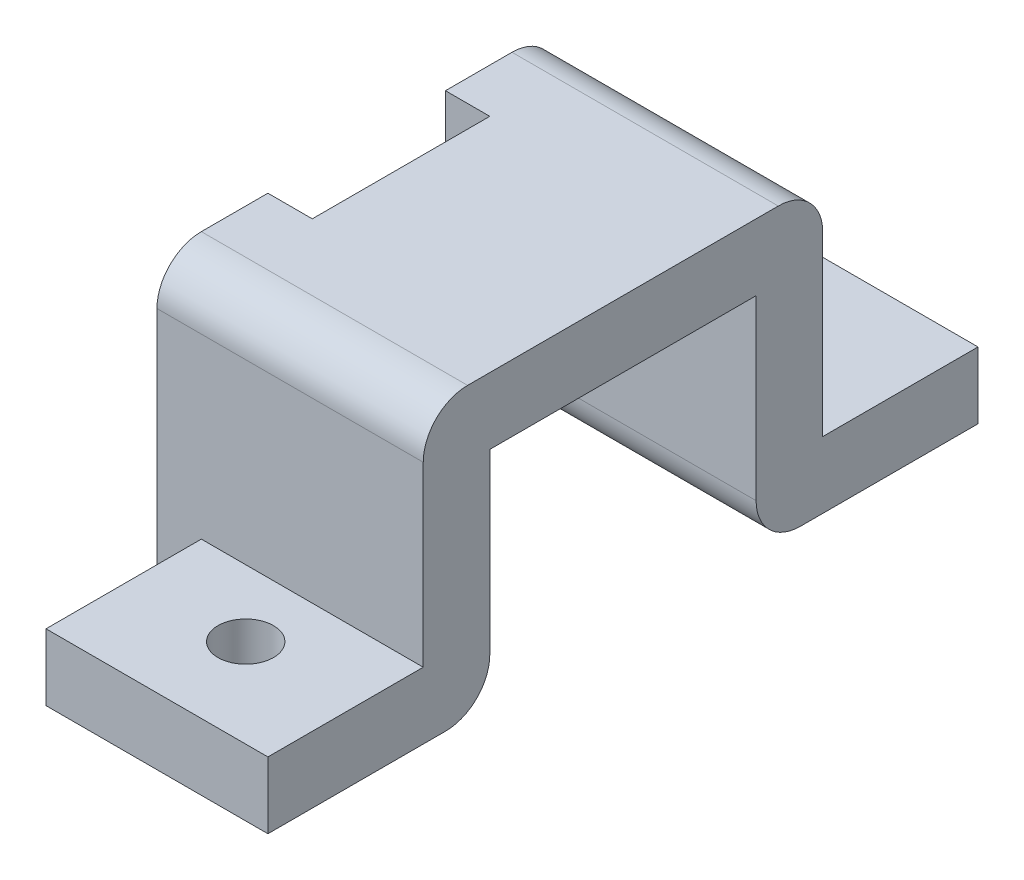
ISO-10303-21;
HEADER;
FILE_DESCRIPTION(('STEP AP214'),'2;1');
FILE_NAME('part.step','',(''),(''),'','','');
FILE_SCHEMA(('AUTOMOTIVE_DESIGN { 1 0 10303 214 1 1 1 1 }'));
ENDSEC;
DATA;
#1=APPLICATION_CONTEXT('core data for automotive mechanical design processes');
#2=APPLICATION_PROTOCOL_DEFINITION('international standard','automotive_design',2000,#1);
#3=PRODUCT_CONTEXT('',#1,'mechanical');
#4=PRODUCT('Part','Part','',(#3));
#5=PRODUCT_RELATED_PRODUCT_CATEGORY('part','',(#4));
#6=PRODUCT_DEFINITION_FORMATION('','',#4);
#7=PRODUCT_DEFINITION_CONTEXT('part definition',#1,'design');
#8=PRODUCT_DEFINITION('design','',#6,#7);
#9=PRODUCT_DEFINITION_SHAPE('','',#8);
#10=(LENGTH_UNIT() NAMED_UNIT(*) SI_UNIT(.MILLI.,.METRE.));
#11=(NAMED_UNIT(*) PLANE_ANGLE_UNIT() SI_UNIT($,.RADIAN.));
#12=(NAMED_UNIT(*) SI_UNIT($,.STERADIAN.) SOLID_ANGLE_UNIT());
#13=UNCERTAINTY_MEASURE_WITH_UNIT(LENGTH_MEASURE(1.E-05),#10,'distance_accuracy_value','');
#14=(GEOMETRIC_REPRESENTATION_CONTEXT(3) GLOBAL_UNCERTAINTY_ASSIGNED_CONTEXT((#13)) GLOBAL_UNIT_ASSIGNED_CONTEXT((#10,
#11,#12)) REPRESENTATION_CONTEXT('',''));
#15=CARTESIAN_POINT('',(0.,0.,0.));
#16=DIRECTION('',(0.,0.,1.));
#17=DIRECTION('',(1.,0.,0.));
#18=AXIS2_PLACEMENT_3D('',#15,#16,#17);
#19=CARTESIAN_POINT('',(10.,-2.,7.));
#20=DIRECTION('',(1.,0.,0.));
#21=DIRECTION('',(0.,0.,-1.));
#22=AXIS2_PLACEMENT_3D('',#19,#20,#21);
#23=CYLINDRICAL_SURFACE('',#22,2.);
#24=DIRECTION('',(-1.,0.,0.));
#25=VECTOR('',#24,1.);
#26=CARTESIAN_POINT('',(10.,-2.,9.));
#27=LINE('',#26,#25);
#28=CARTESIAN_POINT('',(10.,-2.,9.));
#29=VERTEX_POINT('',#28);
#30=CARTESIAN_POINT('',(-2.,-2.,9.));
#31=VERTEX_POINT('',#30);
#32=EDGE_CURVE('E420',#29,#31,#27,.T.);
#33=ORIENTED_EDGE('',*,*,#32,.F.);
#34=CARTESIAN_POINT('',(10.,-2.,7.));
#35=DIRECTION('',(-1.,0.,0.));
#36=DIRECTION('',(0.,0.,1.));
#37=AXIS2_PLACEMENT_3D('',#34,#35,#36);
#38=CIRCLE('',#37,2.);
#39=CARTESIAN_POINT('',(10.,0.,7.));
#40=VERTEX_POINT('',#39);
#41=EDGE_CURVE('E42',#40,#29,#38,.F.);
#42=ORIENTED_EDGE('',*,*,#41,.F.);
#43=DIRECTION('',(-1.,0.,0.));
#44=VECTOR('',#43,1.);
#45=CARTESIAN_POINT('',(10.,0.,7.));
#46=LINE('',#45,#44);
#47=CARTESIAN_POINT('',(-2.,0.,7.));
#48=VERTEX_POINT('',#47);
#49=EDGE_CURVE('E423',#48,#40,#46,.F.);
#50=ORIENTED_EDGE('',*,*,#49,.F.);
#51=CARTESIAN_POINT('',(-2.,-2.,7.));
#52=DIRECTION('',(1.,0.,0.));
#53=DIRECTION('',(0.,0.,-1.));
#54=AXIS2_PLACEMENT_3D('',#51,#52,#53);
#55=CIRCLE('',#54,2.);
#56=EDGE_CURVE('E11',#31,#48,#55,.F.);
#57=ORIENTED_EDGE('',*,*,#56,.F.);
#58=EDGE_LOOP('',(#33,#42,#50,#57));
#59=FACE_BOUND('',#58,.T.);
#60=ADVANCED_FACE('F35',(#59),#23,.T.);
#61=CARTESIAN_POINT('',(10.,-2.,-7.));
#62=DIRECTION('',(1.,0.,0.));
#63=DIRECTION('',(0.,0.,-1.));
#64=AXIS2_PLACEMENT_3D('',#61,#62,#63);
#65=CYLINDRICAL_SURFACE('',#64,2.);
#66=DIRECTION('',(1.,0.,0.));
#67=VECTOR('',#66,1.);
#68=CARTESIAN_POINT('',(10.,-2.,-9.));
#69=LINE('',#68,#67);
#70=CARTESIAN_POINT('',(-2.,-1.99999999999999,-9.));
#71=VERTEX_POINT('',#70);
#72=CARTESIAN_POINT('',(10.,-2.,-9.));
#73=VERTEX_POINT('',#72);
#74=EDGE_CURVE('E409',#71,#73,#69,.T.);
#75=ORIENTED_EDGE('',*,*,#74,.F.);
#76=CARTESIAN_POINT('',(-2.,-2.,-7.));
#77=DIRECTION('',(-1.,0.,0.));
#78=DIRECTION('',(0.,0.,1.));
#79=AXIS2_PLACEMENT_3D('',#76,#77,#78);
#80=CIRCLE('',#79,2.);
#81=CARTESIAN_POINT('',(-2.,0.,-7.));
#82=VERTEX_POINT('',#81);
#83=EDGE_CURVE('E415',#82,#71,#80,.T.);
#84=ORIENTED_EDGE('',*,*,#83,.F.);
#85=DIRECTION('',(1.,0.,0.));
#86=VECTOR('',#85,1.);
#87=CARTESIAN_POINT('',(10.,0.,-7.));
#88=LINE('',#87,#86);
#89=CARTESIAN_POINT('',(10.,0.,-7.));
#90=VERTEX_POINT('',#89);
#91=EDGE_CURVE('E412',#90,#82,#88,.F.);
#92=ORIENTED_EDGE('',*,*,#91,.F.);
#93=CARTESIAN_POINT('',(10.,-2.,-7.));
#94=DIRECTION('',(-1.,0.,0.));
#95=DIRECTION('',(0.,0.,1.));
#96=AXIS2_PLACEMENT_3D('',#93,#94,#95);
#97=CIRCLE('',#96,2.);
#98=EDGE_CURVE('E417',#73,#90,#97,.F.);
#99=ORIENTED_EDGE('',*,*,#98,.F.);
#100=EDGE_LOOP('',(#75,#84,#92,#99));
#101=FACE_BOUND('',#100,.T.);
#102=ADVANCED_FACE('F527',(#101),#65,.T.);
#103=CARTESIAN_POINT('',(10.,-3.,-6.));
#104=DIRECTION('',(0.,-1.,0.));
#105=DIRECTION('',(0.,0.,-1.));
#106=AXIS2_PLACEMENT_3D('',#103,#104,#105);
#107=PLANE('',#106);
#108=DIRECTION('',(-1.,0.,0.));
#109=VECTOR('',#108,1.);
#110=CARTESIAN_POINT('',(8.,-3.,-1.));
#111=LINE('',#110,#109);
#112=CARTESIAN_POINT('',(8.,-3.,-1.));
#113=VERTEX_POINT('',#112);
#114=CARTESIAN_POINT('',(6.5,-3.,-1.));
#115=VERTEX_POINT('',#114);
#116=EDGE_CURVE('E472',#113,#115,#111,.T.);
#117=ORIENTED_EDGE('',*,*,#116,.F.);
#118=DIRECTION('',(0.,0.,1.));
#119=VECTOR('',#118,1.);
#120=CARTESIAN_POINT('',(8.,-3.,-6.));
#121=LINE('',#120,#119);
#122=CARTESIAN_POINT('',(8.,-3.,-6.));
#123=VERTEX_POINT('',#122);
#124=EDGE_CURVE('E234',#123,#113,#121,.T.);
#125=ORIENTED_EDGE('',*,*,#124,.F.);
#126=DIRECTION('',(-1.,0.,0.));
#127=VECTOR('',#126,1.);
#128=CARTESIAN_POINT('',(10.,-3.,-6.));
#129=LINE('',#128,#127);
#130=CARTESIAN_POINT('',(10.,-3.,-6.));
#131=VERTEX_POINT('',#130);
#132=EDGE_CURVE('E370',#131,#123,#129,.T.);
#133=ORIENTED_EDGE('',*,*,#132,.F.);
#134=DIRECTION('',(0.,0.,1.));
#135=VECTOR('',#134,1.);
#136=CARTESIAN_POINT('',(10.,-3.,-6.));
#137=LINE('',#136,#135);
#138=CARTESIAN_POINT('',(10.,-3.,6.));
#139=VERTEX_POINT('',#138);
#140=EDGE_CURVE('E315',#131,#139,#137,.T.);
#141=ORIENTED_EDGE('',*,*,#140,.T.);
#142=DIRECTION('',(-1.,0.,0.));
#143=VECTOR('',#142,1.);
#144=CARTESIAN_POINT('',(10.,-3.,6.));
#145=LINE('',#144,#143);
#146=CARTESIAN_POINT('',(0.,-3.,6.));
#147=VERTEX_POINT('',#146);
#148=EDGE_CURVE('E373',#139,#147,#145,.T.);
#149=ORIENTED_EDGE('',*,*,#148,.T.);
#150=DIRECTION('',(0.,0.,1.));
#151=VECTOR('',#150,1.);
#152=CARTESIAN_POINT('',(0.,-3.,-6.));
#153=LINE('',#152,#151);
#154=CARTESIAN_POINT('',(0.,-3.,3.99999999999999));
#155=VERTEX_POINT('',#154);
#156=EDGE_CURVE('E344',#155,#147,#153,.T.);
#157=ORIENTED_EDGE('',*,*,#156,.F.);
#158=CARTESIAN_POINT('',(0.,-3.,-4.));
#159=VERTEX_POINT('',#158);
#160=EDGE_CURVE('E349',#159,#155,#153,.T.);
#161=ORIENTED_EDGE('',*,*,#160,.F.);
#162=CARTESIAN_POINT('',(0.,-3.,-6.));
#163=VERTEX_POINT('',#162);
#164=EDGE_CURVE('E345',#163,#159,#153,.T.);
#165=ORIENTED_EDGE('',*,*,#164,.F.);
#166=CARTESIAN_POINT('',(6.5,-3.,-6.));
#167=VERTEX_POINT('',#166);
#168=EDGE_CURVE('E369',#167,#163,#129,.T.);
#169=ORIENTED_EDGE('',*,*,#168,.F.);
#170=DIRECTION('',(0.,0.,-1.));
#171=VECTOR('',#170,1.);
#172=CARTESIAN_POINT('',(6.5,-3.,-6.));
#173=LINE('',#172,#171);
#174=EDGE_CURVE('E231',#115,#167,#173,.T.);
#175=ORIENTED_EDGE('',*,*,#174,.F.);
#176=EDGE_LOOP('',(#117,#125,#133,#141,#149,#157,#161,#165,#169,#175));
#177=FACE_BOUND('',#176,.T.);
#178=ADVANCED_FACE('F463',(#177),#107,.T.);
#179=CARTESIAN_POINT('',(10.,-13.,-6.));
#180=DIRECTION('',(0.,0.,1.));
#181=DIRECTION('',(0.,-1.,0.));
#182=AXIS2_PLACEMENT_3D('',#179,#180,#181);
#183=PLANE('',#182);
#184=ORIENTED_EDGE('',*,*,#132,.T.);
#185=DIRECTION('',(0.,1.,0.));
#186=VECTOR('',#185,1.);
#187=CARTESIAN_POINT('',(8.,-5.,-6.));
#188=LINE('',#187,#186);
#189=CARTESIAN_POINT('',(8.,-5.,-6.));
#190=VERTEX_POINT('',#189);
#191=EDGE_CURVE('E466',#190,#123,#188,.T.);
#192=ORIENTED_EDGE('',*,*,#191,.F.);
#193=DIRECTION('',(1.,0.,0.));
#194=VECTOR('',#193,1.);
#195=CARTESIAN_POINT('',(8.,-5.,-6.));
#196=LINE('',#195,#194);
#197=CARTESIAN_POINT('',(6.5,-5.,-6.));
#198=VERTEX_POINT('',#197);
#199=EDGE_CURVE('E228',#198,#190,#196,.T.);
#200=ORIENTED_EDGE('',*,*,#199,.F.);
#201=DIRECTION('',(0.,1.,0.));
#202=VECTOR('',#201,1.);
#203=CARTESIAN_POINT('',(6.5,-5.,-6.));
#204=LINE('',#203,#202);
#205=EDGE_CURVE('E239',#198,#167,#204,.T.);
#206=ORIENTED_EDGE('',*,*,#205,.T.);
#207=ORIENTED_EDGE('',*,*,#168,.T.);
#208=DIRECTION('',(0.,1.,0.));
#209=VECTOR('',#208,1.);
#210=CARTESIAN_POINT('',(0.,-13.,-6.));
#211=LINE('',#210,#209);
#212=CARTESIAN_POINT('',(0.,-11.,-6.));
#213=VERTEX_POINT('',#212);
#214=EDGE_CURVE('E348',#213,#163,#211,.T.);
#215=ORIENTED_EDGE('',*,*,#214,.F.);
#216=DIRECTION('',(1.,0.,0.));
#217=VECTOR('',#216,1.);
#218=CARTESIAN_POINT('',(10.,-11.,-6.));
#219=LINE('',#218,#217);
#220=CARTESIAN_POINT('',(10.,-11.,-6.));
#221=VERTEX_POINT('',#220);
#222=EDGE_CURVE('E394',#213,#221,#219,.T.);
#223=ORIENTED_EDGE('',*,*,#222,.T.);
#224=DIRECTION('',(0.,1.,0.));
#225=VECTOR('',#224,1.);
#226=CARTESIAN_POINT('',(10.,-13.,-6.));
#227=LINE('',#226,#225);
#228=EDGE_CURVE('E318',#221,#131,#227,.T.);
#229=ORIENTED_EDGE('',*,*,#228,.T.);
#230=EDGE_LOOP('',(#184,#192,#200,#206,#207,#215,#223,#229));
#231=FACE_BOUND('',#230,.T.);
#232=ADVANCED_FACE('F465',(#231),#183,.T.);
#233=CARTESIAN_POINT('',(0.,0.,0.));
#234=DIRECTION('',(-1.,0.,0.));
#235=DIRECTION('',(0.,0.,1.));
#236=AXIS2_PLACEMENT_3D('',#233,#234,#235);
#237=PLANE('',#236);
#238=DIRECTION('',(0.,0.,1.));
#239=VECTOR('',#238,1.);
#240=CARTESIAN_POINT('',(0.,-13.,-16.));
#241=LINE('',#240,#239);
#242=CARTESIAN_POINT('',(0.,-13.,-16.));
#243=VERTEX_POINT('',#242);
#244=CARTESIAN_POINT('',(0.,-13.,-9.));
#245=VERTEX_POINT('',#244);
#246=EDGE_CURVE('E352',#243,#245,#241,.T.);
#247=ORIENTED_EDGE('',*,*,#246,.T.);
#248=DIRECTION('',(0.,1.,0.));
#249=VECTOR('',#248,1.);
#250=CARTESIAN_POINT('',(0.,0.,-9.));
#251=LINE('',#250,#249);
#252=CARTESIAN_POINT('',(0.,-10.,-9.));
#253=VERTEX_POINT('',#252);
#254=EDGE_CURVE('E407',#245,#253,#251,.T.);
#255=ORIENTED_EDGE('',*,*,#254,.T.);
#256=DIRECTION('',(0.,0.,-1.));
#257=VECTOR('',#256,1.);
#258=CARTESIAN_POINT('',(0.,-10.,-9.));
#259=LINE('',#258,#257);
#260=CARTESIAN_POINT('',(0.,-10.,-16.));
#261=VERTEX_POINT('',#260);
#262=EDGE_CURVE('E358',#253,#261,#259,.T.);
#263=ORIENTED_EDGE('',*,*,#262,.T.);
#264=DIRECTION('',(0.,-1.,0.));
#265=VECTOR('',#264,1.);
#266=CARTESIAN_POINT('',(0.,-10.,-16.));
#267=LINE('',#266,#265);
#268=EDGE_CURVE('E355',#261,#243,#267,.T.);
#269=ORIENTED_EDGE('',*,*,#268,.T.);
#270=EDGE_LOOP('',(#247,#255,#263,#269));
#271=FACE_BOUND('',#270,.T.);
#272=ADVANCED_FACE('F554',(#271),#237,.T.);
#273=DIRECTION('',(0.,0.,-1.));
#274=VECTOR('',#273,1.);
#275=CARTESIAN_POINT('',(0.,0.,9.));
#276=LINE('',#275,#274);
#277=CARTESIAN_POINT('',(0.,0.,4.));
#278=VERTEX_POINT('',#277);
#279=CARTESIAN_POINT('',(0.,0.,-3.99999999999999));
#280=VERTEX_POINT('',#279);
#281=EDGE_CURVE('E305',#278,#280,#276,.T.);
#282=ORIENTED_EDGE('',*,*,#281,.T.);
#283=DIRECTION('',(0.,-1.,0.));
#284=VECTOR('',#283,1.);
#285=CARTESIAN_POINT('',(0.,0.,-3.99999999999999));
#286=LINE('',#285,#284);
#287=EDGE_CURVE('E404',#280,#159,#286,.T.);
#288=ORIENTED_EDGE('',*,*,#287,.T.);
#289=ORIENTED_EDGE('',*,*,#160,.T.);
#290=DIRECTION('',(0.,-1.,0.));
#291=VECTOR('',#290,1.);
#292=CARTESIAN_POINT('',(0.,-13.,4.));
#293=LINE('',#292,#291);
#294=EDGE_CURVE('E273',#278,#155,#293,.T.);
#295=ORIENTED_EDGE('',*,*,#294,.F.);
#296=EDGE_LOOP('',(#282,#288,#289,#295));
#297=FACE_BOUND('',#296,.T.);
#298=ADVANCED_FACE('F486',(#297),#237,.T.);
#299=DIRECTION('',(0.,1.,0.));
#300=VECTOR('',#299,1.);
#301=CARTESIAN_POINT('',(0.,-13.,9.));
#302=LINE('',#301,#300);
#303=CARTESIAN_POINT('',(0.,-13.,9.));
#304=VERTEX_POINT('',#303);
#305=CARTESIAN_POINT('',(0.,-10.,9.));
#306=VERTEX_POINT('',#305);
#307=EDGE_CURVE('E266',#304,#306,#302,.T.);
#308=ORIENTED_EDGE('',*,*,#307,.F.);
#309=DIRECTION('',(0.,0.,1.));
#310=VECTOR('',#309,1.);
#311=CARTESIAN_POINT('',(0.,-13.,6.));
#312=LINE('',#311,#310);
#313=CARTESIAN_POINT('',(0.,-13.,16.));
#314=VERTEX_POINT('',#313);
#315=EDGE_CURVE('E339',#304,#314,#312,.T.);
#316=ORIENTED_EDGE('',*,*,#315,.T.);
#317=DIRECTION('',(0.,1.,0.));
#318=VECTOR('',#317,1.);
#319=CARTESIAN_POINT('',(0.,-13.,16.));
#320=LINE('',#319,#318);
#321=CARTESIAN_POINT('',(0.,-10.,16.));
#322=VERTEX_POINT('',#321);
#323=EDGE_CURVE('E336',#314,#322,#320,.T.);
#324=ORIENTED_EDGE('',*,*,#323,.T.);
#325=DIRECTION('',(0.,0.,1.));
#326=VECTOR('',#325,1.);
#327=CARTESIAN_POINT('',(0.,-10.,9.));
#328=LINE('',#327,#326);
#329=EDGE_CURVE('E297',#306,#322,#328,.T.);
#330=ORIENTED_EDGE('',*,*,#329,.F.);
#331=EDGE_LOOP('',(#308,#316,#324,#330));
#332=FACE_BOUND('',#331,.T.);
#333=ADVANCED_FACE('F537',(#332),#237,.T.);
#334=CARTESIAN_POINT('',(10.,-11.,-8.));
#335=DIRECTION('',(1.,0.,0.));
#336=DIRECTION('',(0.,0.,-1.));
#337=AXIS2_PLACEMENT_3D('',#334,#335,#336);
#338=CYLINDRICAL_SURFACE('',#337,2.);
#339=ORIENTED_EDGE('',*,*,#222,.F.);
#340=CARTESIAN_POINT('',(0.,-11.,-8.));
#341=DIRECTION('',(-1.,0.,0.));
#342=DIRECTION('',(0.,0.,1.));
#343=AXIS2_PLACEMENT_3D('',#340,#341,#342);
#344=CIRCLE('',#343,2.);
#345=CARTESIAN_POINT('',(0.,-13.,-8.));
#346=VERTEX_POINT('',#345);
#347=EDGE_CURVE('E400',#346,#213,#344,.T.);
#348=ORIENTED_EDGE('',*,*,#347,.F.);
#349=DIRECTION('',(1.,0.,0.));
#350=VECTOR('',#349,1.);
#351=CARTESIAN_POINT('',(10.,-13.,-8.));
#352=LINE('',#351,#350);
#353=CARTESIAN_POINT('',(10.,-13.,-8.));
#354=VERTEX_POINT('',#353);
#355=EDGE_CURVE('E397',#354,#346,#352,.F.);
#356=ORIENTED_EDGE('',*,*,#355,.F.);
#357=CARTESIAN_POINT('',(10.,-11.,-8.));
#358=DIRECTION('',(-1.,0.,0.));
#359=DIRECTION('',(0.,0.,1.));
#360=AXIS2_PLACEMENT_3D('',#357,#358,#359);
#361=CIRCLE('',#360,2.);
#362=EDGE_CURVE('E402',#221,#354,#361,.F.);
#363=ORIENTED_EDGE('',*,*,#362,.F.);
#364=EDGE_LOOP('',(#339,#348,#356,#363));
#365=FACE_BOUND('',#364,.T.);
#366=ADVANCED_FACE('F509',(#365),#338,.T.);
#367=CARTESIAN_POINT('',(10.,-11.,8.));
#368=DIRECTION('',(-1.,0.,0.));
#369=DIRECTION('',(0.,0.,1.));
#370=AXIS2_PLACEMENT_3D('',#367,#368,#369);
#371=CYLINDRICAL_SURFACE('',#370,2.);
#372=DIRECTION('',(-1.,0.,0.));
#373=VECTOR('',#372,1.);
#374=CARTESIAN_POINT('',(10.,-11.,6.));
#375=LINE('',#374,#373);
#376=CARTESIAN_POINT('',(10.,-11.,6.));
#377=VERTEX_POINT('',#376);
#378=CARTESIAN_POINT('',(0.,-11.,6.));
#379=VERTEX_POINT('',#378);
#380=EDGE_CURVE('E383',#377,#379,#375,.T.);
#381=ORIENTED_EDGE('',*,*,#380,.F.);
#382=CARTESIAN_POINT('',(10.,-11.,8.));
#383=DIRECTION('',(-1.,0.,0.));
#384=DIRECTION('',(0.,0.,1.));
#385=AXIS2_PLACEMENT_3D('',#382,#383,#384);
#386=CIRCLE('',#385,2.);
#387=CARTESIAN_POINT('',(10.,-13.,8.));
#388=VERTEX_POINT('',#387);
#389=EDGE_CURVE('E389',#388,#377,#386,.F.);
#390=ORIENTED_EDGE('',*,*,#389,.F.);
#391=DIRECTION('',(-1.,0.,0.));
#392=VECTOR('',#391,1.);
#393=CARTESIAN_POINT('',(10.,-13.,8.));
#394=LINE('',#393,#392);
#395=CARTESIAN_POINT('',(0.,-13.,8.));
#396=VERTEX_POINT('',#395);
#397=EDGE_CURVE('E386',#396,#388,#394,.F.);
#398=ORIENTED_EDGE('',*,*,#397,.F.);
#399=CARTESIAN_POINT('',(0.,-11.,8.));
#400=DIRECTION('',(-1.,0.,0.));
#401=DIRECTION('',(0.,0.,1.));
#402=AXIS2_PLACEMENT_3D('',#399,#400,#401);
#403=CIRCLE('',#402,2.);
#404=EDGE_CURVE('E391',#379,#396,#403,.T.);
#405=ORIENTED_EDGE('',*,*,#404,.F.);
#406=EDGE_LOOP('',(#381,#390,#398,#405));
#407=FACE_BOUND('',#406,.T.);
#408=ADVANCED_FACE('F449',(#407),#371,.T.);
#409=CARTESIAN_POINT('',(10.,0.,9.));
#410=DIRECTION('',(0.,0.,-1.));
#411=DIRECTION('',(0.,1.,0.));
#412=AXIS2_PLACEMENT_3D('',#409,#410,#411);
#413=PLANE('',#412);
#414=DIRECTION('',(0.,-1.,0.));
#415=VECTOR('',#414,1.);
#416=CARTESIAN_POINT('',(10.,0.,9.));
#417=LINE('',#416,#415);
#418=CARTESIAN_POINT('',(10.,-10.,9.));
#419=VERTEX_POINT('',#418);
#420=EDGE_CURVE('E302',#29,#419,#417,.T.);
#421=ORIENTED_EDGE('',*,*,#420,.F.);
#422=ORIENTED_EDGE('',*,*,#32,.T.);
#423=DIRECTION('',(0.,1.,0.));
#424=VECTOR('',#423,1.);
#425=CARTESIAN_POINT('',(-2.,-13.,9.));
#426=LINE('',#425,#424);
#427=CARTESIAN_POINT('',(-2.,-13.,9.));
#428=VERTEX_POINT('',#427);
#429=EDGE_CURVE('E270',#428,#31,#426,.T.);
#430=ORIENTED_EDGE('',*,*,#429,.F.);
#431=DIRECTION('',(1.,0.,0.));
#432=VECTOR('',#431,1.);
#433=CARTESIAN_POINT('',(-2.,-13.,9.));
#434=LINE('',#433,#432);
#435=EDGE_CURVE('E272',#428,#304,#434,.T.);
#436=ORIENTED_EDGE('',*,*,#435,.T.);
#437=ORIENTED_EDGE('',*,*,#307,.T.);
#438=DIRECTION('',(-1.,0.,0.));
#439=VECTOR('',#438,1.);
#440=CARTESIAN_POINT('',(10.,-10.,9.));
#441=LINE('',#440,#439);
#442=EDGE_CURVE('E380',#419,#306,#441,.T.);
#443=ORIENTED_EDGE('',*,*,#442,.F.);
#444=EDGE_LOOP('',(#421,#422,#430,#436,#437,#443));
#445=FACE_BOUND('',#444,.T.);
#446=ADVANCED_FACE('F432',(#445),#413,.F.);
#447=CARTESIAN_POINT('',(10.,-10.,9.));
#448=DIRECTION('',(0.,-1.,0.));
#449=DIRECTION('',(0.,0.,-1.));
#450=AXIS2_PLACEMENT_3D('',#447,#448,#449);
#451=PLANE('',#450);
#452=CARTESIAN_POINT('',(5.,-9.99999999999999,12.));
#453=DIRECTION('',(0.,1.,0.));
#454=DIRECTION('',(0.,0.,1.));
#455=AXIS2_PLACEMENT_3D('',#452,#453,#454);
#456=CIRCLE('',#455,1.25);
#457=CARTESIAN_POINT('',(5.,-9.99999999999999,10.75));
#458=VERTEX_POINT('',#457);
#459=EDGE_CURVE('E293',#458,#458,#456,.F.);
#460=ORIENTED_EDGE('',*,*,#459,.T.);
#461=EDGE_LOOP('',(#460));
#462=FACE_BOUND('',#461,.T.);
#463=ORIENTED_EDGE('',*,*,#329,.T.);
#464=DIRECTION('',(-1.,0.,0.));
#465=VECTOR('',#464,1.);
#466=CARTESIAN_POINT('',(10.,-10.,16.));
#467=LINE('',#466,#465);
#468=CARTESIAN_POINT('',(10.,-10.,16.));
#469=VERTEX_POINT('',#468);
#470=EDGE_CURVE('E378',#469,#322,#467,.T.);
#471=ORIENTED_EDGE('',*,*,#470,.F.);
#472=DIRECTION('',(0.,0.,1.));
#473=VECTOR('',#472,1.);
#474=CARTESIAN_POINT('',(10.,-10.,9.));
#475=LINE('',#474,#473);
#476=EDGE_CURVE('E304',#419,#469,#475,.T.);
#477=ORIENTED_EDGE('',*,*,#476,.F.);
#478=ORIENTED_EDGE('',*,*,#442,.T.);
#479=EDGE_LOOP('',(#463,#471,#477,#478));
#480=FACE_BOUND('',#479,.T.);
#481=ADVANCED_FACE('F434',(#462,#480),#451,.F.);
#482=CARTESIAN_POINT('',(10.,-13.,16.));
#483=DIRECTION('',(0.,0.,1.));
#484=DIRECTION('',(1.,0.,0.));
#485=AXIS2_PLACEMENT_3D('',#482,#483,#484);
#486=PLANE('',#485);
#487=ORIENTED_EDGE('',*,*,#323,.F.);
#488=DIRECTION('',(-1.,0.,0.));
#489=VECTOR('',#488,1.);
#490=CARTESIAN_POINT('',(10.,-13.,16.));
#491=LINE('',#490,#489);
#492=CARTESIAN_POINT('',(10.,-13.,16.));
#493=VERTEX_POINT('',#492);
#494=EDGE_CURVE('E375',#493,#314,#491,.T.);
#495=ORIENTED_EDGE('',*,*,#494,.F.);
#496=DIRECTION('',(0.,1.,0.));
#497=VECTOR('',#496,1.);
#498=CARTESIAN_POINT('',(10.,-13.,16.));
#499=LINE('',#498,#497);
#500=EDGE_CURVE('E307',#493,#469,#499,.T.);
#501=ORIENTED_EDGE('',*,*,#500,.T.);
#502=ORIENTED_EDGE('',*,*,#470,.T.);
#503=EDGE_LOOP('',(#487,#495,#501,#502));
#504=FACE_BOUND('',#503,.T.);
#505=ADVANCED_FACE('F441',(#504),#486,.T.);
#506=CARTESIAN_POINT('',(10.,-13.,6.));
#507=DIRECTION('',(0.,-1.,0.));
#508=DIRECTION('',(0.,0.,-1.));
#509=AXIS2_PLACEMENT_3D('',#506,#507,#508);
#510=PLANE('',#509);
#511=CARTESIAN_POINT('',(5.,-13.,12.));
#512=DIRECTION('',(0.,-1.,0.));
#513=DIRECTION('',(0.,0.,-1.));
#514=AXIS2_PLACEMENT_3D('',#511,#512,#513);
#515=CIRCLE('',#514,1.25);
#516=CARTESIAN_POINT('',(5.,-13.,10.75));
#517=VERTEX_POINT('',#516);
#518=EDGE_CURVE('E290',#517,#517,#515,.T.);
#519=ORIENTED_EDGE('',*,*,#518,.F.);
#520=EDGE_LOOP('',(#519));
#521=FACE_BOUND('',#520,.T.);
#522=ORIENTED_EDGE('',*,*,#315,.F.);
#523=ORIENTED_EDGE('',*,*,#435,.F.);
#524=DIRECTION('',(0.,0.,1.));
#525=VECTOR('',#524,1.);
#526=CARTESIAN_POINT('',(-2.,-13.,9.));
#527=LINE('',#526,#525);
#528=CARTESIAN_POINT('',(-2.,-13.,4.));
#529=VERTEX_POINT('',#528);
#530=EDGE_CURVE('E268',#529,#428,#527,.T.);
#531=ORIENTED_EDGE('',*,*,#530,.F.);
#532=DIRECTION('',(1.,0.,0.));
#533=VECTOR('',#532,1.);
#534=CARTESIAN_POINT('',(-2.,-13.,4.));
#535=LINE('',#534,#533);
#536=CARTESIAN_POINT('',(0.,-13.,4.));
#537=VERTEX_POINT('',#536);
#538=EDGE_CURVE('E283',#529,#537,#535,.T.);
#539=ORIENTED_EDGE('',*,*,#538,.T.);
#540=DIRECTION('',(0.,0.,1.));
#541=VECTOR('',#540,1.);
#542=CARTESIAN_POINT('',(0.,-13.,9.));
#543=LINE('',#542,#541);
#544=EDGE_CURVE('E276',#537,#396,#543,.T.);
#545=ORIENTED_EDGE('',*,*,#544,.T.);
#546=ORIENTED_EDGE('',*,*,#397,.T.);
#547=DIRECTION('',(0.,0.,1.));
#548=VECTOR('',#547,1.);
#549=CARTESIAN_POINT('',(10.,-13.,6.));
#550=LINE('',#549,#548);
#551=EDGE_CURVE('E310',#388,#493,#550,.T.);
#552=ORIENTED_EDGE('',*,*,#551,.T.);
#553=ORIENTED_EDGE('',*,*,#494,.T.);
#554=EDGE_LOOP('',(#522,#523,#531,#539,#545,#546,#552,#553));
#555=FACE_BOUND('',#554,.T.);
#556=ADVANCED_FACE('F444',(#521,#555),#510,.T.);
#557=CARTESIAN_POINT('',(10.,-3.,6.));
#558=DIRECTION('',(0.,0.,-1.));
#559=DIRECTION('',(0.,1.,0.));
#560=AXIS2_PLACEMENT_3D('',#557,#558,#559);
#561=PLANE('',#560);
#562=DIRECTION('',(0.,-1.,0.));
#563=VECTOR('',#562,1.);
#564=CARTESIAN_POINT('',(10.,-3.,6.));
#565=LINE('',#564,#563);
#566=EDGE_CURVE('E312',#139,#377,#565,.T.);
#567=ORIENTED_EDGE('',*,*,#566,.T.);
#568=ORIENTED_EDGE('',*,*,#380,.T.);
#569=DIRECTION('',(0.,-1.,0.));
#570=VECTOR('',#569,1.);
#571=CARTESIAN_POINT('',(0.,-3.,6.));
#572=LINE('',#571,#570);
#573=EDGE_CURVE('E341',#147,#379,#572,.T.);
#574=ORIENTED_EDGE('',*,*,#573,.F.);
#575=ORIENTED_EDGE('',*,*,#148,.F.);
#576=EDGE_LOOP('',(#567,#568,#574,#575));
#577=FACE_BOUND('',#576,.T.);
#578=ADVANCED_FACE('F457',(#577),#561,.T.);
#579=CARTESIAN_POINT('',(10.,-13.,-16.));
#580=DIRECTION('',(0.,-1.,0.));
#581=DIRECTION('',(0.,0.,-1.));
#582=AXIS2_PLACEMENT_3D('',#579,#580,#581);
#583=PLANE('',#582);
#584=CARTESIAN_POINT('',(5.,-13.,-12.));
#585=DIRECTION('',(0.,-1.,0.));
#586=DIRECTION('',(0.,0.,-1.));
#587=AXIS2_PLACEMENT_3D('',#584,#585,#586);
#588=CIRCLE('',#587,1.25);
#589=CARTESIAN_POINT('',(5.,-13.,-13.25));
#590=VERTEX_POINT('',#589);
#591=EDGE_CURVE('E289',#590,#590,#588,.T.);
#592=ORIENTED_EDGE('',*,*,#591,.F.);
#593=EDGE_LOOP('',(#592));
#594=FACE_BOUND('',#593,.T.);
#595=DIRECTION('',(0.,0.,1.));
#596=VECTOR('',#595,1.);
#597=CARTESIAN_POINT('',(10.,-13.,-16.));
#598=LINE('',#597,#596);
#599=CARTESIAN_POINT('',(10.,-13.,-16.));
#600=VERTEX_POINT('',#599);
#601=EDGE_CURVE('E320',#600,#354,#598,.T.);
#602=ORIENTED_EDGE('',*,*,#601,.T.);
#603=ORIENTED_EDGE('',*,*,#355,.T.);
#604=DIRECTION('',(0.,0.,1.));
#605=VECTOR('',#604,1.);
#606=CARTESIAN_POINT('',(0.,-13.,-9.));
#607=LINE('',#606,#605);
#608=CARTESIAN_POINT('',(0.,-13.,-4.));
#609=VERTEX_POINT('',#608);
#610=EDGE_CURVE('E235',#346,#609,#607,.T.);
#611=ORIENTED_EDGE('',*,*,#610,.T.);
#612=DIRECTION('',(1.,0.,0.));
#613=VECTOR('',#612,1.);
#614=CARTESIAN_POINT('',(-2.,-13.,-4.));
#615=LINE('',#614,#613);
#616=CARTESIAN_POINT('',(-2.,-13.,-4.));
#617=VERTEX_POINT('',#616);
#618=EDGE_CURVE('E256',#617,#609,#615,.T.);
#619=ORIENTED_EDGE('',*,*,#618,.F.);
#620=DIRECTION('',(0.,0.,1.));
#621=VECTOR('',#620,1.);
#622=CARTESIAN_POINT('',(-2.,-13.,-9.));
#623=LINE('',#622,#621);
#624=CARTESIAN_POINT('',(-2.,-13.,-9.));
#625=VERTEX_POINT('',#624);
#626=EDGE_CURVE('E248',#625,#617,#623,.T.);
#627=ORIENTED_EDGE('',*,*,#626,.F.);
#628=DIRECTION('',(1.,0.,0.));
#629=VECTOR('',#628,1.);
#630=CARTESIAN_POINT('',(-2.,-13.,-9.));
#631=LINE('',#630,#629);
#632=EDGE_CURVE('E259',#625,#245,#631,.T.);
#633=ORIENTED_EDGE('',*,*,#632,.T.);
#634=ORIENTED_EDGE('',*,*,#246,.F.);
#635=DIRECTION('',(-1.,0.,0.));
#636=VECTOR('',#635,1.);
#637=CARTESIAN_POINT('',(10.,-13.,-16.));
#638=LINE('',#637,#636);
#639=EDGE_CURVE('E367',#600,#243,#638,.T.);
#640=ORIENTED_EDGE('',*,*,#639,.F.);
#641=EDGE_LOOP('',(#602,#603,#611,#619,#627,#633,#634,#640));
#642=FACE_BOUND('',#641,.T.);
#643=ADVANCED_FACE('F504',(#594,#642),#583,.T.);
#644=CARTESIAN_POINT('',(10.,-10.,-16.));
#645=DIRECTION('',(0.,0.,-1.));
#646=DIRECTION('',(-1.,0.,0.));
#647=AXIS2_PLACEMENT_3D('',#644,#645,#646);
#648=PLANE('',#647);
#649=ORIENTED_EDGE('',*,*,#268,.F.);
#650=DIRECTION('',(-1.,0.,0.));
#651=VECTOR('',#650,1.);
#652=CARTESIAN_POINT('',(10.,-10.,-16.));
#653=LINE('',#652,#651);
#654=CARTESIAN_POINT('',(10.,-10.,-16.));
#655=VERTEX_POINT('',#654);
#656=EDGE_CURVE('E365',#655,#261,#653,.T.);
#657=ORIENTED_EDGE('',*,*,#656,.F.);
#658=DIRECTION('',(0.,-1.,0.));
#659=VECTOR('',#658,1.);
#660=CARTESIAN_POINT('',(10.,-10.,-16.));
#661=LINE('',#660,#659);
#662=EDGE_CURVE('E323',#655,#600,#661,.T.);
#663=ORIENTED_EDGE('',*,*,#662,.T.);
#664=ORIENTED_EDGE('',*,*,#639,.T.);
#665=EDGE_LOOP('',(#649,#657,#663,#664));
#666=FACE_BOUND('',#665,.T.);
#667=ADVANCED_FACE('F515',(#666),#648,.T.);
#668=CARTESIAN_POINT('',(10.,-10.,-9.));
#669=DIRECTION('',(0.,1.,0.));
#670=DIRECTION('',(0.,0.,1.));
#671=AXIS2_PLACEMENT_3D('',#668,#669,#670);
#672=PLANE('',#671);
#673=CARTESIAN_POINT('',(5.,-10.,-12.));
#674=DIRECTION('',(0.,1.,0.));
#675=DIRECTION('',(0.,0.,1.));
#676=AXIS2_PLACEMENT_3D('',#673,#674,#675);
#677=CIRCLE('',#676,1.25);
#678=CARTESIAN_POINT('',(5.,-10.,-13.25));
#679=VERTEX_POINT('',#678);
#680=EDGE_CURVE('E294',#679,#679,#677,.F.);
#681=ORIENTED_EDGE('',*,*,#680,.T.);
#682=EDGE_LOOP('',(#681));
#683=FACE_BOUND('',#682,.T.);
#684=ORIENTED_EDGE('',*,*,#262,.F.);
#685=DIRECTION('',(-1.,0.,0.));
#686=VECTOR('',#685,1.);
#687=CARTESIAN_POINT('',(10.,-10.,-9.));
#688=LINE('',#687,#686);
#689=CARTESIAN_POINT('',(10.,-10.,-9.));
#690=VERTEX_POINT('',#689);
#691=EDGE_CURVE('E333',#690,#253,#688,.T.);
#692=ORIENTED_EDGE('',*,*,#691,.F.);
#693=DIRECTION('',(0.,0.,-1.));
#694=VECTOR('',#693,1.);
#695=CARTESIAN_POINT('',(10.,-10.,-9.));
#696=LINE('',#695,#694);
#697=EDGE_CURVE('E326',#690,#655,#696,.T.);
#698=ORIENTED_EDGE('',*,*,#697,.T.);
#699=ORIENTED_EDGE('',*,*,#656,.T.);
#700=EDGE_LOOP('',(#684,#692,#698,#699));
#701=FACE_BOUND('',#700,.T.);
#702=ADVANCED_FACE('F519',(#683,#701),#672,.T.);
#703=CARTESIAN_POINT('',(10.,0.,-9.));
#704=DIRECTION('',(0.,0.,-1.));
#705=DIRECTION('',(0.,1.,0.));
#706=AXIS2_PLACEMENT_3D('',#703,#704,#705);
#707=PLANE('',#706);
#708=DIRECTION('',(0.,-1.,0.));
#709=VECTOR('',#708,1.);
#710=CARTESIAN_POINT('',(-2.,-13.,-9.));
#711=LINE('',#710,#709);
#712=EDGE_CURVE('E246',#71,#625,#711,.T.);
#713=ORIENTED_EDGE('',*,*,#712,.F.);
#714=ORIENTED_EDGE('',*,*,#74,.T.);
#715=DIRECTION('',(0.,-1.,0.));
#716=VECTOR('',#715,1.);
#717=CARTESIAN_POINT('',(10.,0.,-9.));
#718=LINE('',#717,#716);
#719=EDGE_CURVE('E329',#73,#690,#718,.T.);
#720=ORIENTED_EDGE('',*,*,#719,.T.);
#721=ORIENTED_EDGE('',*,*,#691,.T.);
#722=ORIENTED_EDGE('',*,*,#254,.F.);
#723=ORIENTED_EDGE('',*,*,#632,.F.);
#724=EDGE_LOOP('',(#713,#714,#720,#721,#722,#723));
#725=FACE_BOUND('',#724,.T.);
#726=ADVANCED_FACE('F524',(#725),#707,.T.);
#727=CARTESIAN_POINT('',(10.,0.,9.));
#728=DIRECTION('',(0.,1.,0.));
#729=DIRECTION('',(0.,0.,1.));
#730=AXIS2_PLACEMENT_3D('',#727,#728,#729);
#731=PLANE('',#730);
#732=DIRECTION('',(0.,0.,-1.));
#733=VECTOR('',#732,1.);
#734=CARTESIAN_POINT('',(-2.,0.,9.));
#735=LINE('',#734,#733);
#736=CARTESIAN_POINT('',(-2.,0.,3.99999999999999));
#737=VERTEX_POINT('',#736);
#738=EDGE_CURVE('E263',#48,#737,#735,.T.);
#739=ORIENTED_EDGE('',*,*,#738,.F.);
#740=ORIENTED_EDGE('',*,*,#49,.T.);
#741=DIRECTION('',(0.,0.,-1.));
#742=VECTOR('',#741,1.);
#743=CARTESIAN_POINT('',(10.,0.,9.));
#744=LINE('',#743,#742);
#745=EDGE_CURVE('E331',#40,#90,#744,.T.);
#746=ORIENTED_EDGE('',*,*,#745,.T.);
#747=ORIENTED_EDGE('',*,*,#91,.T.);
#748=DIRECTION('',(0.,0.,-1.));
#749=VECTOR('',#748,1.);
#750=CARTESIAN_POINT('',(-2.,0.,-9.));
#751=LINE('',#750,#749);
#752=CARTESIAN_POINT('',(-2.,0.,-3.99999999999999));
#753=VERTEX_POINT('',#752);
#754=EDGE_CURVE('E243',#753,#82,#751,.T.);
#755=ORIENTED_EDGE('',*,*,#754,.F.);
#756=DIRECTION('',(1.,0.,0.));
#757=VECTOR('',#756,1.);
#758=CARTESIAN_POINT('',(-2.,0.,-3.99999999999999));
#759=LINE('',#758,#757);
#760=EDGE_CURVE('E251',#753,#280,#759,.T.);
#761=ORIENTED_EDGE('',*,*,#760,.T.);
#762=ORIENTED_EDGE('',*,*,#281,.F.);
#763=DIRECTION('',(1.,0.,0.));
#764=VECTOR('',#763,1.);
#765=CARTESIAN_POINT('',(-2.,0.,3.99999999999999));
#766=LINE('',#765,#764);
#767=EDGE_CURVE('E286',#737,#278,#766,.T.);
#768=ORIENTED_EDGE('',*,*,#767,.F.);
#769=EDGE_LOOP('',(#739,#740,#746,#747,#755,#761,#762,#768));
#770=FACE_BOUND('',#769,.T.);
#771=ADVANCED_FACE('F495',(#770),#731,.T.);
#772=CARTESIAN_POINT('',(10.,0.,0.));
#773=DIRECTION('',(-1.,0.,0.));
#774=DIRECTION('',(0.,0.,1.));
#775=AXIS2_PLACEMENT_3D('',#772,#773,#774);
#776=PLANE('',#775);
#777=ORIENTED_EDGE('',*,*,#745,.F.);
#778=ORIENTED_EDGE('',*,*,#41,.T.);
#779=ORIENTED_EDGE('',*,*,#420,.T.);
#780=ORIENTED_EDGE('',*,*,#476,.T.);
#781=ORIENTED_EDGE('',*,*,#500,.F.);
#782=ORIENTED_EDGE('',*,*,#551,.F.);
#783=ORIENTED_EDGE('',*,*,#389,.T.);
#784=ORIENTED_EDGE('',*,*,#566,.F.);
#785=ORIENTED_EDGE('',*,*,#140,.F.);
#786=ORIENTED_EDGE('',*,*,#228,.F.);
#787=ORIENTED_EDGE('',*,*,#362,.T.);
#788=ORIENTED_EDGE('',*,*,#601,.F.);
#789=ORIENTED_EDGE('',*,*,#662,.F.);
#790=ORIENTED_EDGE('',*,*,#697,.F.);
#791=ORIENTED_EDGE('',*,*,#719,.F.);
#792=ORIENTED_EDGE('',*,*,#98,.T.);
#793=EDGE_LOOP('',(#777,#778,#779,#780,#781,#782,#783,#784,#785,#786,#787,#788,#789,#790,#791,#792));
#794=FACE_BOUND('',#793,.T.);
#795=ADVANCED_FACE('F426',(#794),#776,.F.);
#796=CARTESIAN_POINT('',(5.,-6.46446609406727,-12.));
#797=DIRECTION('',(0.,-1.,0.));
#798=DIRECTION('',(0.,0.,-1.));
#799=AXIS2_PLACEMENT_3D('',#796,#797,#798);
#800=CYLINDRICAL_SURFACE('',#799,1.25);
#801=CARTESIAN_POINT('',(5.,-13.,-13.25));
#802=CARTESIAN_POINT('',(5.,-12.96875,-13.25));
#803=CARTESIAN_POINT('',(5.,-12.9375,-13.25));
#804=CARTESIAN_POINT('',(5.,-12.875,-13.25));
#805=CARTESIAN_POINT('',(5.,-12.84375,-13.25));
#806=CARTESIAN_POINT('',(5.,-12.78125,-13.25));
#807=CARTESIAN_POINT('',(5.,-12.75,-13.25));
#808=CARTESIAN_POINT('',(5.,-12.6875,-13.25));
#809=CARTESIAN_POINT('',(5.,-12.65625,-13.25));
#810=CARTESIAN_POINT('',(5.,-12.59375,-13.25));
#811=CARTESIAN_POINT('',(5.,-12.5625,-13.25));
#812=CARTESIAN_POINT('',(5.,-12.5,-13.25));
#813=CARTESIAN_POINT('',(5.,-12.46875,-13.25));
#814=CARTESIAN_POINT('',(5.,-12.40625,-13.25));
#815=CARTESIAN_POINT('',(5.,-12.375,-13.25));
#816=CARTESIAN_POINT('',(5.,-12.3125,-13.25));
#817=CARTESIAN_POINT('',(5.,-12.28125,-13.25));
#818=CARTESIAN_POINT('',(5.,-12.21875,-13.25));
#819=CARTESIAN_POINT('',(5.,-12.1875,-13.25));
#820=CARTESIAN_POINT('',(5.,-12.125,-13.25));
#821=CARTESIAN_POINT('',(5.,-12.09375,-13.25));
#822=CARTESIAN_POINT('',(5.,-12.03125,-13.25));
#823=CARTESIAN_POINT('',(5.,-12.,-13.25));
#824=CARTESIAN_POINT('',(5.,-11.9375,-13.25));
#825=CARTESIAN_POINT('',(5.,-11.90625,-13.25));
#826=CARTESIAN_POINT('',(5.,-11.84375,-13.25));
#827=CARTESIAN_POINT('',(5.,-11.8125,-13.25));
#828=CARTESIAN_POINT('',(5.,-11.75,-13.25));
#829=CARTESIAN_POINT('',(5.,-11.71875,-13.25));
#830=CARTESIAN_POINT('',(5.,-11.65625,-13.25));
#831=CARTESIAN_POINT('',(5.,-11.625,-13.25));
#832=CARTESIAN_POINT('',(5.,-11.5625,-13.25));
#833=CARTESIAN_POINT('',(5.,-11.53125,-13.25));
#834=CARTESIAN_POINT('',(5.,-11.46875,-13.25));
#835=CARTESIAN_POINT('',(5.,-11.4375,-13.25));
#836=CARTESIAN_POINT('',(5.,-11.375,-13.25));
#837=CARTESIAN_POINT('',(5.,-11.34375,-13.25));
#838=CARTESIAN_POINT('',(5.,-11.28125,-13.25));
#839=CARTESIAN_POINT('',(5.,-11.25,-13.25));
#840=CARTESIAN_POINT('',(5.,-11.1875,-13.25));
#841=CARTESIAN_POINT('',(5.,-11.15625,-13.25));
#842=CARTESIAN_POINT('',(5.,-11.09375,-13.25));
#843=CARTESIAN_POINT('',(5.,-11.0625,-13.25));
#844=CARTESIAN_POINT('',(5.,-11.,-13.25));
#845=CARTESIAN_POINT('',(5.,-10.96875,-13.25));
#846=CARTESIAN_POINT('',(5.,-10.90625,-13.25));
#847=CARTESIAN_POINT('',(5.,-10.875,-13.25));
#848=CARTESIAN_POINT('',(5.,-10.8125,-13.25));
#849=CARTESIAN_POINT('',(5.,-10.78125,-13.25));
#850=CARTESIAN_POINT('',(5.,-10.71875,-13.25));
#851=CARTESIAN_POINT('',(5.,-10.6875,-13.25));
#852=CARTESIAN_POINT('',(5.,-10.625,-13.25));
#853=CARTESIAN_POINT('',(5.,-10.59375,-13.25));
#854=CARTESIAN_POINT('',(5.,-10.53125,-13.25));
#855=CARTESIAN_POINT('',(5.,-10.5,-13.25));
#856=CARTESIAN_POINT('',(5.,-10.4375,-13.25));
#857=CARTESIAN_POINT('',(5.,-10.40625,-13.25));
#858=CARTESIAN_POINT('',(5.,-10.34375,-13.25));
#859=CARTESIAN_POINT('',(5.,-10.3125,-13.25));
#860=CARTESIAN_POINT('',(5.,-10.25,-13.25));
#861=CARTESIAN_POINT('',(5.,-10.21875,-13.25));
#862=CARTESIAN_POINT('',(5.,-10.15625,-13.25));
#863=CARTESIAN_POINT('',(5.,-10.125,-13.25));
#864=CARTESIAN_POINT('',(5.,-10.0625,-13.25));
#865=CARTESIAN_POINT('',(5.,-10.03125,-13.25));
#866=CARTESIAN_POINT('',(5.,-10.,-13.25));
#867=B_SPLINE_CURVE_WITH_KNOTS('',3,(#801,#802,#803,#804,#805,#806,#807,#808,#809,#810,#811,
#812,#813,#814,#815,#816,#817,#818,#819,#820,#821,#822,#823,#824,#825,#826,#827,#828,#829,#830,
#831,#832,#833,#834,#835,#836,#837,#838,#839,#840,#841,#842,#843,#844,#845,#846,#847,#848,#849,
#850,#851,#852,#853,#854,#855,#856,#857,#858,#859,#860,#861,#862,#863,#864,#865,#866),
.UNSPECIFIED.,.F.,.F.,(4,2,2,2,2,2,2,2,2,2,2,2,2,2,2,2,2,2,2,2,2,2,2,2,2,2,2,2,2,2,2,2,4),(0.,
0.0937500000000001,0.1875,0.28125,0.375,0.468750000000002,0.562500000000002,0.656250000000002,
0.750000000000002,0.843750000000002,0.937500000000003,1.03125,1.125,1.21875,1.3125,1.40625,1.5,
1.59375,1.6875,1.78125,1.875,1.96875,2.0625,2.15625,2.25,2.34375,2.4375,2.53125000000001,
2.62500000000001,2.71875,2.81250000000001,2.90625000000001,3.00000000000001),.UNSPECIFIED.);
#868=EDGE_CURVE('BSEAM572',#590,#679,#867,.T.);
#869=ORIENTED_EDGE('',*,*,#591,.T.);
#870=ORIENTED_EDGE('',*,*,#680,.F.);
#871=ORIENTED_EDGE('',*,*,#868,.T.);
#872=ORIENTED_EDGE('',*,*,#868,.F.);
#873=EDGE_LOOP('',(#869,#871,#870,#872));
#874=FACE_BOUND('',#873,.T.);
#875=ADVANCED_FACE('F572',(#874),#800,.F.);
#876=CARTESIAN_POINT('',(5.,-6.46446609406725,12.));
#877=DIRECTION('',(0.,-1.,0.));
#878=DIRECTION('',(0.,0.,-1.));
#879=AXIS2_PLACEMENT_3D('',#876,#877,#878);
#880=CYLINDRICAL_SURFACE('',#879,1.25);
#881=CARTESIAN_POINT('',(5.,-13.,10.75));
#882=CARTESIAN_POINT('',(5.,-12.96875,10.75));
#883=CARTESIAN_POINT('',(5.,-12.9375,10.75));
#884=CARTESIAN_POINT('',(5.,-12.875,10.75));
#885=CARTESIAN_POINT('',(5.,-12.84375,10.75));
#886=CARTESIAN_POINT('',(5.,-12.78125,10.75));
#887=CARTESIAN_POINT('',(5.,-12.75,10.75));
#888=CARTESIAN_POINT('',(5.,-12.6875,10.75));
#889=CARTESIAN_POINT('',(5.,-12.65625,10.75));
#890=CARTESIAN_POINT('',(5.,-12.59375,10.75));
#891=CARTESIAN_POINT('',(5.,-12.5625,10.75));
#892=CARTESIAN_POINT('',(5.,-12.5,10.75));
#893=CARTESIAN_POINT('',(5.,-12.46875,10.75));
#894=CARTESIAN_POINT('',(5.,-12.40625,10.75));
#895=CARTESIAN_POINT('',(5.,-12.375,10.75));
#896=CARTESIAN_POINT('',(5.,-12.3125,10.75));
#897=CARTESIAN_POINT('',(5.,-12.28125,10.75));
#898=CARTESIAN_POINT('',(5.,-12.21875,10.75));
#899=CARTESIAN_POINT('',(5.,-12.1875,10.75));
#900=CARTESIAN_POINT('',(5.,-12.125,10.75));
#901=CARTESIAN_POINT('',(5.,-12.09375,10.75));
#902=CARTESIAN_POINT('',(5.,-12.03125,10.75));
#903=CARTESIAN_POINT('',(5.,-12.,10.75));
#904=CARTESIAN_POINT('',(5.,-11.9375,10.75));
#905=CARTESIAN_POINT('',(5.,-11.90625,10.75));
#906=CARTESIAN_POINT('',(5.,-11.84375,10.75));
#907=CARTESIAN_POINT('',(5.,-11.8125,10.75));
#908=CARTESIAN_POINT('',(5.,-11.75,10.75));
#909=CARTESIAN_POINT('',(5.,-11.71875,10.75));
#910=CARTESIAN_POINT('',(5.,-11.65625,10.75));
#911=CARTESIAN_POINT('',(5.,-11.625,10.75));
#912=CARTESIAN_POINT('',(5.,-11.5625,10.75));
#913=CARTESIAN_POINT('',(5.,-11.53125,10.75));
#914=CARTESIAN_POINT('',(5.,-11.46875,10.75));
#915=CARTESIAN_POINT('',(5.,-11.4375,10.75));
#916=CARTESIAN_POINT('',(5.,-11.375,10.75));
#917=CARTESIAN_POINT('',(5.,-11.34375,10.75));
#918=CARTESIAN_POINT('',(5.,-11.28125,10.75));
#919=CARTESIAN_POINT('',(5.,-11.25,10.75));
#920=CARTESIAN_POINT('',(5.,-11.1875,10.75));
#921=CARTESIAN_POINT('',(5.,-11.15625,10.75));
#922=CARTESIAN_POINT('',(5.,-11.09375,10.75));
#923=CARTESIAN_POINT('',(5.,-11.0625,10.75));
#924=CARTESIAN_POINT('',(5.,-11.,10.75));
#925=CARTESIAN_POINT('',(5.,-10.96875,10.75));
#926=CARTESIAN_POINT('',(5.,-10.90625,10.75));
#927=CARTESIAN_POINT('',(5.,-10.875,10.75));
#928=CARTESIAN_POINT('',(5.,-10.8125,10.75));
#929=CARTESIAN_POINT('',(5.,-10.78125,10.75));
#930=CARTESIAN_POINT('',(5.,-10.71875,10.75));
#931=CARTESIAN_POINT('',(5.,-10.6875,10.75));
#932=CARTESIAN_POINT('',(5.,-10.625,10.75));
#933=CARTESIAN_POINT('',(5.,-10.59375,10.75));
#934=CARTESIAN_POINT('',(5.,-10.53125,10.75));
#935=CARTESIAN_POINT('',(5.,-10.5,10.75));
#936=CARTESIAN_POINT('',(5.,-10.4375,10.75));
#937=CARTESIAN_POINT('',(5.,-10.40625,10.75));
#938=CARTESIAN_POINT('',(5.,-10.34375,10.75));
#939=CARTESIAN_POINT('',(5.,-10.3125,10.75));
#940=CARTESIAN_POINT('',(5.,-10.25,10.75));
#941=CARTESIAN_POINT('',(5.,-10.21875,10.75));
#942=CARTESIAN_POINT('',(5.,-10.15625,10.75));
#943=CARTESIAN_POINT('',(5.,-10.125,10.75));
#944=CARTESIAN_POINT('',(5.,-10.0625,10.75));
#945=CARTESIAN_POINT('',(5.,-10.03125,10.75));
#946=CARTESIAN_POINT('',(5.,-9.99999999999999,10.75));
#947=B_SPLINE_CURVE_WITH_KNOTS('',3,(#881,#882,#883,#884,#885,#886,#887,#888,#889,#890,#891,
#892,#893,#894,#895,#896,#897,#898,#899,#900,#901,#902,#903,#904,#905,#906,#907,#908,#909,#910,
#911,#912,#913,#914,#915,#916,#917,#918,#919,#920,#921,#922,#923,#924,#925,#926,#927,#928,#929,
#930,#931,#932,#933,#934,#935,#936,#937,#938,#939,#940,#941,#942,#943,#944,#945,#946),
.UNSPECIFIED.,.F.,.F.,(4,2,2,2,2,2,2,2,2,2,2,2,2,2,2,2,2,2,2,2,2,2,2,2,2,2,2,2,2,2,2,2,4),(0.,
0.0937500000000001,0.1875,0.28125,0.375,0.46875,0.5625,0.656249999999999,0.749999999999999,
0.843749999999999,0.937499999999999,1.03125,1.125,1.21875,1.3125,1.40625,1.5,1.59375,1.6875,
1.78125,1.875,1.96875,2.0625,2.15625,2.25,2.34375,2.4375,2.53125,2.625,2.71875,2.8125,2.90625,
3.),.UNSPECIFIED.);
#948=EDGE_CURVE('BSEAM575',#517,#458,#947,.T.);
#949=ORIENTED_EDGE('',*,*,#518,.T.);
#950=ORIENTED_EDGE('',*,*,#459,.F.);
#951=ORIENTED_EDGE('',*,*,#948,.T.);
#952=ORIENTED_EDGE('',*,*,#948,.F.);
#953=EDGE_LOOP('',(#949,#951,#950,#952));
#954=FACE_BOUND('',#953,.T.);
#955=ADVANCED_FACE('F575',(#954),#880,.F.);
#956=CARTESIAN_POINT('',(-2.,-13.,4.));
#957=DIRECTION('',(0.,0.,1.));
#958=DIRECTION('',(0.,-1.,0.));
#959=AXIS2_PLACEMENT_3D('',#956,#957,#958);
#960=PLANE('',#959);
#961=ORIENTED_EDGE('',*,*,#294,.T.);
#962=EDGE_CURVE('E262',#155,#537,#293,.T.);
#963=ORIENTED_EDGE('',*,*,#962,.T.);
#964=ORIENTED_EDGE('',*,*,#538,.F.);
#965=DIRECTION('',(0.,-1.,0.));
#966=VECTOR('',#965,1.);
#967=CARTESIAN_POINT('',(-2.,-13.,4.));
#968=LINE('',#967,#966);
#969=EDGE_CURVE('E265',#737,#529,#968,.T.);
#970=ORIENTED_EDGE('',*,*,#969,.F.);
#971=ORIENTED_EDGE('',*,*,#767,.T.);
#972=EDGE_LOOP('',(#961,#963,#964,#970,#971));
#973=FACE_BOUND('',#972,.T.);
#974=ADVANCED_FACE('F579',(#973),#960,.F.);
#975=CARTESIAN_POINT('',(-2.,0.,0.));
#976=DIRECTION('',(1.,0.,0.));
#977=DIRECTION('',(0.,0.,-1.));
#978=AXIS2_PLACEMENT_3D('',#975,#976,#977);
#979=PLANE('',#978);
#980=ORIENTED_EDGE('',*,*,#429,.T.);
#981=ORIENTED_EDGE('',*,*,#56,.T.);
#982=ORIENTED_EDGE('',*,*,#738,.T.);
#983=ORIENTED_EDGE('',*,*,#969,.T.);
#984=ORIENTED_EDGE('',*,*,#530,.T.);
#985=EDGE_LOOP('',(#980,#981,#982,#983,#984));
#986=FACE_BOUND('',#985,.T.);
#987=ADVANCED_FACE('F583',(#986),#979,.F.);
#988=CARTESIAN_POINT('',(0.,0.,0.));
#989=DIRECTION('',(1.,0.,0.));
#990=DIRECTION('',(0.,0.,-1.));
#991=AXIS2_PLACEMENT_3D('',#988,#989,#990);
#992=PLANE('',#991);
#993=ORIENTED_EDGE('',*,*,#962,.F.);
#994=ORIENTED_EDGE('',*,*,#156,.T.);
#995=ORIENTED_EDGE('',*,*,#573,.T.);
#996=ORIENTED_EDGE('',*,*,#404,.T.);
#997=ORIENTED_EDGE('',*,*,#544,.F.);
#998=EDGE_LOOP('',(#993,#994,#995,#996,#997));
#999=FACE_BOUND('',#998,.T.);
#1000=ADVANCED_FACE('F452',(#999),#992,.T.);
#1001=CARTESIAN_POINT('',(-2.,-13.,-4.));
#1002=DIRECTION('',(0.,0.,-1.));
#1003=DIRECTION('',(0.,1.,0.));
#1004=AXIS2_PLACEMENT_3D('',#1001,#1002,#1003);
#1005=PLANE('',#1004);
#1006=DIRECTION('',(0.,1.,0.));
#1007=VECTOR('',#1006,1.);
#1008=CARTESIAN_POINT('',(0.,-13.,-4.));
#1009=LINE('',#1008,#1007);
#1010=EDGE_CURVE('E237',#609,#159,#1009,.T.);
#1011=ORIENTED_EDGE('',*,*,#1010,.T.);
#1012=ORIENTED_EDGE('',*,*,#287,.F.);
#1013=ORIENTED_EDGE('',*,*,#760,.F.);
#1014=DIRECTION('',(0.,1.,0.));
#1015=VECTOR('',#1014,1.);
#1016=CARTESIAN_POINT('',(-2.,-13.,-4.));
#1017=LINE('',#1016,#1015);
#1018=EDGE_CURVE('E250',#617,#753,#1017,.T.);
#1019=ORIENTED_EDGE('',*,*,#1018,.F.);
#1020=ORIENTED_EDGE('',*,*,#618,.T.);
#1021=EDGE_LOOP('',(#1011,#1012,#1013,#1019,#1020));
#1022=FACE_BOUND('',#1021,.T.);
#1023=ADVANCED_FACE('F490',(#1022),#1005,.F.);
#1024=CARTESIAN_POINT('',(-2.,0.,0.));
#1025=DIRECTION('',(-1.,0.,0.));
#1026=DIRECTION('',(0.,0.,1.));
#1027=AXIS2_PLACEMENT_3D('',#1024,#1025,#1026);
#1028=PLANE('',#1027);
#1029=ORIENTED_EDGE('',*,*,#754,.T.);
#1030=ORIENTED_EDGE('',*,*,#83,.T.);
#1031=ORIENTED_EDGE('',*,*,#712,.T.);
#1032=ORIENTED_EDGE('',*,*,#626,.T.);
#1033=ORIENTED_EDGE('',*,*,#1018,.T.);
#1034=EDGE_LOOP('',(#1029,#1030,#1031,#1032,#1033));
#1035=FACE_BOUND('',#1034,.T.);
#1036=ADVANCED_FACE('F499',(#1035),#1028,.T.);
#1037=CARTESIAN_POINT('',(0.,0.,0.));
#1038=DIRECTION('',(-1.,0.,0.));
#1039=DIRECTION('',(0.,0.,1.));
#1040=AXIS2_PLACEMENT_3D('',#1037,#1038,#1039);
#1041=PLANE('',#1040);
#1042=ORIENTED_EDGE('',*,*,#347,.T.);
#1043=ORIENTED_EDGE('',*,*,#214,.T.);
#1044=ORIENTED_EDGE('',*,*,#164,.T.);
#1045=ORIENTED_EDGE('',*,*,#1010,.F.);
#1046=ORIENTED_EDGE('',*,*,#610,.F.);
#1047=EDGE_LOOP('',(#1042,#1043,#1044,#1045,#1046));
#1048=FACE_BOUND('',#1047,.T.);
#1049=ADVANCED_FACE('F484',(#1048),#1041,.F.);
#1050=CARTESIAN_POINT('',(8.,-5.,-6.));
#1051=DIRECTION('',(-1.,0.,0.));
#1052=DIRECTION('',(0.,0.,1.));
#1053=AXIS2_PLACEMENT_3D('',#1050,#1051,#1052);
#1054=PLANE('',#1053);
#1055=ORIENTED_EDGE('',*,*,#124,.T.);
#1056=DIRECTION('',(0.,1.,0.));
#1057=VECTOR('',#1056,1.);
#1058=CARTESIAN_POINT('',(8.,-5.,-1.));
#1059=LINE('',#1058,#1057);
#1060=CARTESIAN_POINT('',(8.,-5.,-1.));
#1061=VERTEX_POINT('',#1060);
#1062=EDGE_CURVE('E215',#1061,#113,#1059,.T.);
#1063=ORIENTED_EDGE('',*,*,#1062,.F.);
#1064=DIRECTION('',(0.,0.,1.));
#1065=VECTOR('',#1064,1.);
#1066=CARTESIAN_POINT('',(8.,-5.,-6.));
#1067=LINE('',#1066,#1065);
#1068=EDGE_CURVE('E223',#190,#1061,#1067,.T.);
#1069=ORIENTED_EDGE('',*,*,#1068,.F.);
#1070=ORIENTED_EDGE('',*,*,#191,.T.);
#1071=EDGE_LOOP('',(#1055,#1063,#1069,#1070));
#1072=FACE_BOUND('',#1071,.T.);
#1073=ADVANCED_FACE('F233',(#1072),#1054,.F.);
#1074=CARTESIAN_POINT('',(8.,-5.,-1.));
#1075=DIRECTION('',(0.,0.,-1.));
#1076=DIRECTION('',(-1.,0.,0.));
#1077=AXIS2_PLACEMENT_3D('',#1074,#1075,#1076);
#1078=PLANE('',#1077);
#1079=ORIENTED_EDGE('',*,*,#116,.T.);
#1080=DIRECTION('',(0.,1.,0.));
#1081=VECTOR('',#1080,1.);
#1082=CARTESIAN_POINT('',(6.5,-5.,-1.));
#1083=LINE('',#1082,#1081);
#1084=CARTESIAN_POINT('',(6.5,-5.,-1.));
#1085=VERTEX_POINT('',#1084);
#1086=EDGE_CURVE('E218',#1085,#115,#1083,.T.);
#1087=ORIENTED_EDGE('',*,*,#1086,.F.);
#1088=DIRECTION('',(-1.,0.,0.));
#1089=VECTOR('',#1088,1.);
#1090=CARTESIAN_POINT('',(8.,-5.,-1.));
#1091=LINE('',#1090,#1089);
#1092=EDGE_CURVE('E210',#1061,#1085,#1091,.T.);
#1093=ORIENTED_EDGE('',*,*,#1092,.F.);
#1094=ORIENTED_EDGE('',*,*,#1062,.T.);
#1095=EDGE_LOOP('',(#1079,#1087,#1093,#1094));
#1096=FACE_BOUND('',#1095,.T.);
#1097=ADVANCED_FACE('F213',(#1096),#1078,.F.);
#1098=CARTESIAN_POINT('',(6.5,-5.,-6.));
#1099=DIRECTION('',(1.,0.,0.));
#1100=DIRECTION('',(0.,0.,-1.));
#1101=AXIS2_PLACEMENT_3D('',#1098,#1099,#1100);
#1102=PLANE('',#1101);
#1103=ORIENTED_EDGE('',*,*,#174,.T.);
#1104=ORIENTED_EDGE('',*,*,#205,.F.);
#1105=DIRECTION('',(0.,0.,-1.));
#1106=VECTOR('',#1105,1.);
#1107=CARTESIAN_POINT('',(6.5,-5.,-6.));
#1108=LINE('',#1107,#1106);
#1109=EDGE_CURVE('E222',#1085,#198,#1108,.T.);
#1110=ORIENTED_EDGE('',*,*,#1109,.F.);
#1111=ORIENTED_EDGE('',*,*,#1086,.T.);
#1112=EDGE_LOOP('',(#1103,#1104,#1110,#1111));
#1113=FACE_BOUND('',#1112,.T.);
#1114=ADVANCED_FACE('F477',(#1113),#1102,.F.);
#1115=CARTESIAN_POINT('',(0.,-5.,0.));
#1116=DIRECTION('',(0.,-1.,0.));
#1117=DIRECTION('',(0.,0.,-1.));
#1118=AXIS2_PLACEMENT_3D('',#1115,#1116,#1117);
#1119=PLANE('',#1118);
#1120=ORIENTED_EDGE('',*,*,#1068,.T.);
#1121=ORIENTED_EDGE('',*,*,#1092,.T.);
#1122=ORIENTED_EDGE('',*,*,#1109,.T.);
#1123=ORIENTED_EDGE('',*,*,#199,.T.);
#1124=EDGE_LOOP('',(#1120,#1121,#1122,#1123));
#1125=FACE_BOUND('',#1124,.T.);
#1126=ADVANCED_FACE('F227',(#1125),#1119,.T.);
#1127=CLOSED_SHELL('',(#60,#102,#178,#232,#272,#298,#333,#366,#408,#446,#481,#505,#556,#578,
#643,#667,#702,#726,#771,#795,#875,#955,#974,#987,#1000,#1023,#1036,#1049,#1073,#1097,#1114,#1126));
#1128=MANIFOLD_SOLID_BREP('B2',#1127);
#1129=ADVANCED_BREP_SHAPE_REPRESENTATION('',(#18,#1128),#14);
#1130=SHAPE_DEFINITION_REPRESENTATION(#9,#1129);
ENDSEC;
END-ISO-10303-21;
